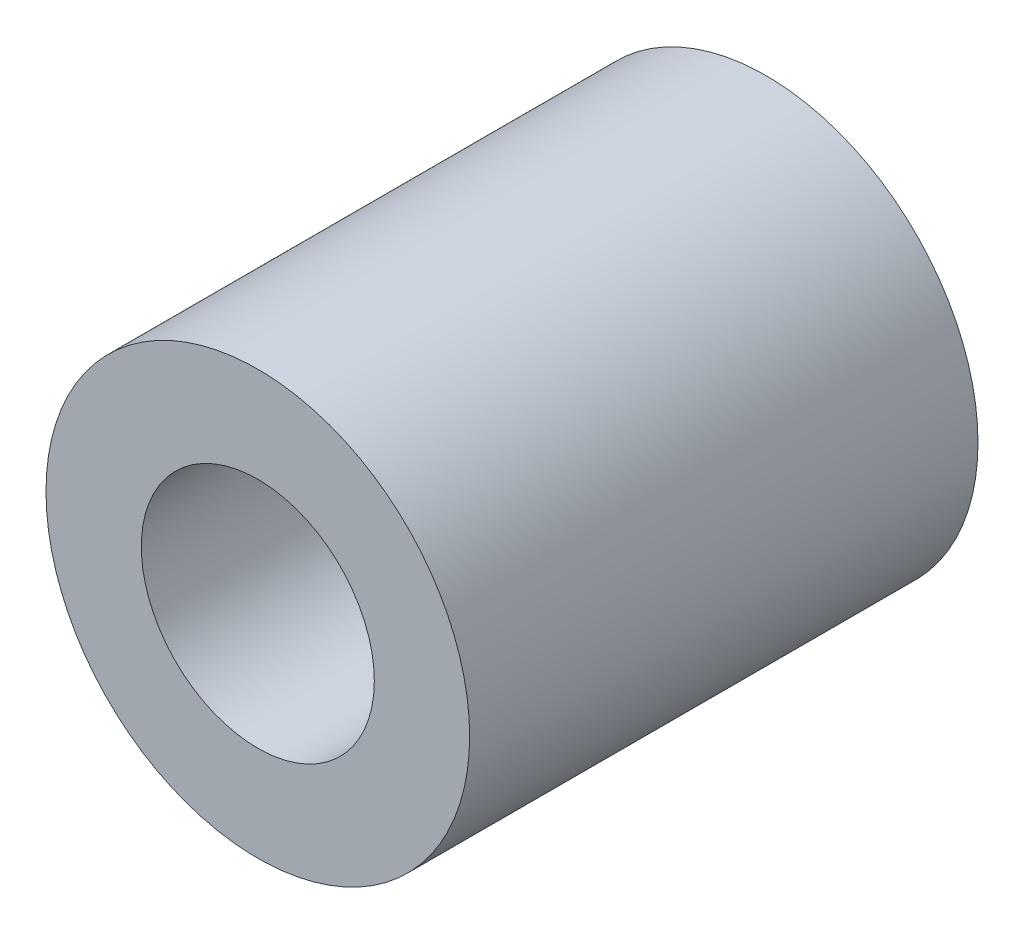
ISO-10303-21;
HEADER;
FILE_DESCRIPTION(('STEP AP214'),'2;1');
FILE_NAME('part.step','',(''),(''),'','','');
FILE_SCHEMA(('AUTOMOTIVE_DESIGN { 1 0 10303 214 1 1 1 1 }'));
ENDSEC;
DATA;
#1=APPLICATION_CONTEXT('core data for automotive mechanical design processes');
#2=APPLICATION_PROTOCOL_DEFINITION('international standard','automotive_design',2000,#1);
#3=PRODUCT_CONTEXT('',#1,'mechanical');
#4=PRODUCT('Part','Part','',(#3));
#5=PRODUCT_RELATED_PRODUCT_CATEGORY('part','',(#4));
#6=PRODUCT_DEFINITION_FORMATION('','',#4);
#7=PRODUCT_DEFINITION_CONTEXT('part definition',#1,'design');
#8=PRODUCT_DEFINITION('design','',#6,#7);
#9=PRODUCT_DEFINITION_SHAPE('','',#8);
#10=(LENGTH_UNIT() NAMED_UNIT(*) SI_UNIT(.MILLI.,.METRE.));
#11=(NAMED_UNIT(*) PLANE_ANGLE_UNIT() SI_UNIT($,.RADIAN.));
#12=(NAMED_UNIT(*) SI_UNIT($,.STERADIAN.) SOLID_ANGLE_UNIT());
#13=UNCERTAINTY_MEASURE_WITH_UNIT(LENGTH_MEASURE(1.E-05),#10,'distance_accuracy_value','');
#14=(GEOMETRIC_REPRESENTATION_CONTEXT(3) GLOBAL_UNCERTAINTY_ASSIGNED_CONTEXT((#13)) GLOBAL_UNIT_ASSIGNED_CONTEXT((#10,
#11,#12)) REPRESENTATION_CONTEXT('',''));
#15=CARTESIAN_POINT('',(0.,0.,0.));
#16=DIRECTION('',(0.,0.,1.));
#17=DIRECTION('',(1.,0.,0.));
#18=AXIS2_PLACEMENT_3D('',#15,#16,#17);
#19=CARTESIAN_POINT('',(0.,0.,12.));
#20=DIRECTION('',(0.,0.,1.));
#21=DIRECTION('',(1.,0.,0.));
#22=AXIS2_PLACEMENT_3D('',#19,#20,#21);
#23=PLANE('',#22);
#24=CARTESIAN_POINT('',(0.,0.,12.));
#25=DIRECTION('',(0.,0.,1.));
#26=DIRECTION('',(1.,0.,0.));
#27=AXIS2_PLACEMENT_3D('',#24,#25,#26);
#28=CIRCLE('',#27,5.);
#29=CARTESIAN_POINT('',(5.,0.,12.));
#30=VERTEX_POINT('',#29);
#31=EDGE_CURVE('E10',#30,#30,#28,.T.);
#32=ORIENTED_EDGE('',*,*,#31,.T.);
#33=EDGE_LOOP('',(#32));
#34=FACE_BOUND('',#33,.T.);
#35=CARTESIAN_POINT('',(0.,0.,12.));
#36=DIRECTION('',(0.,0.,1.));
#37=DIRECTION('',(1.,0.,0.));
#38=AXIS2_PLACEMENT_3D('',#35,#36,#37);
#39=CIRCLE('',#38,2.75);
#40=CARTESIAN_POINT('',(2.75,0.,12.));
#41=VERTEX_POINT('',#40);
#42=EDGE_CURVE('E43',#41,#41,#39,.T.);
#43=ORIENTED_EDGE('',*,*,#42,.F.);
#44=EDGE_LOOP('',(#43));
#45=FACE_BOUND('',#44,.T.);
#46=ADVANCED_FACE('F32',(#34,#45),#23,.T.);
#47=CARTESIAN_POINT('',(0.,0.,0.));
#48=DIRECTION('',(0.,0.,1.));
#49=DIRECTION('',(1.,0.,0.));
#50=AXIS2_PLACEMENT_3D('',#47,#48,#49);
#51=PLANE('',#50);
#52=CARTESIAN_POINT('',(0.,0.,0.));
#53=DIRECTION('',(0.,0.,1.));
#54=DIRECTION('',(1.,0.,0.));
#55=AXIS2_PLACEMENT_3D('',#52,#53,#54);
#56=CIRCLE('',#55,5.);
#57=CARTESIAN_POINT('',(5.,0.,0.));
#58=VERTEX_POINT('',#57);
#59=EDGE_CURVE('E36',#58,#58,#56,.T.);
#60=ORIENTED_EDGE('',*,*,#59,.F.);
#61=EDGE_LOOP('',(#60));
#62=FACE_BOUND('',#61,.T.);
#63=CARTESIAN_POINT('',(0.,0.,0.));
#64=DIRECTION('',(0.,0.,1.));
#65=DIRECTION('',(1.,0.,0.));
#66=AXIS2_PLACEMENT_3D('',#63,#64,#65);
#67=CIRCLE('',#66,2.75);
#68=CARTESIAN_POINT('',(2.75,0.,0.));
#69=VERTEX_POINT('',#68);
#70=EDGE_CURVE('E45',#69,#69,#67,.T.);
#71=ORIENTED_EDGE('',*,*,#70,.T.);
#72=EDGE_LOOP('',(#71));
#73=FACE_BOUND('',#72,.T.);
#74=ADVANCED_FACE('F55',(#62,#73),#51,.F.);
#75=CARTESIAN_POINT('',(0.,0.,12.));
#76=DIRECTION('',(0.,0.,-1.));
#77=DIRECTION('',(-1.,0.,0.));
#78=AXIS2_PLACEMENT_3D('',#75,#76,#77);
#79=CYLINDRICAL_SURFACE('',#78,5.);
#80=ORIENTED_EDGE('',*,*,#31,.F.);
#81=EDGE_LOOP('',(#80));
#82=FACE_BOUND('',#81,.T.);
#83=ORIENTED_EDGE('',*,*,#59,.T.);
#84=EDGE_LOOP('',(#83));
#85=FACE_BOUND('',#84,.T.);
#86=ADVANCED_FACE('F34',(#82,#85),#79,.T.);
#87=CARTESIAN_POINT('',(0.,0.,12.));
#88=DIRECTION('',(0.,0.,-1.));
#89=DIRECTION('',(-1.,0.,0.));
#90=AXIS2_PLACEMENT_3D('',#87,#88,#89);
#91=CYLINDRICAL_SURFACE('',#90,2.75);
#92=ORIENTED_EDGE('',*,*,#42,.T.);
#93=EDGE_LOOP('',(#92));
#94=FACE_BOUND('',#93,.T.);
#95=ORIENTED_EDGE('',*,*,#70,.F.);
#96=EDGE_LOOP('',(#95));
#97=FACE_BOUND('',#96,.T.);
#98=ADVANCED_FACE('F51',(#94,#97),#91,.F.);
#99=CLOSED_SHELL('',(#46,#74,#86,#98));
#100=MANIFOLD_SOLID_BREP('B2',#99);
#101=ADVANCED_BREP_SHAPE_REPRESENTATION('',(#18,#100),#14);
#102=SHAPE_DEFINITION_REPRESENTATION(#9,#101);
ENDSEC;
END-ISO-10303-21;
